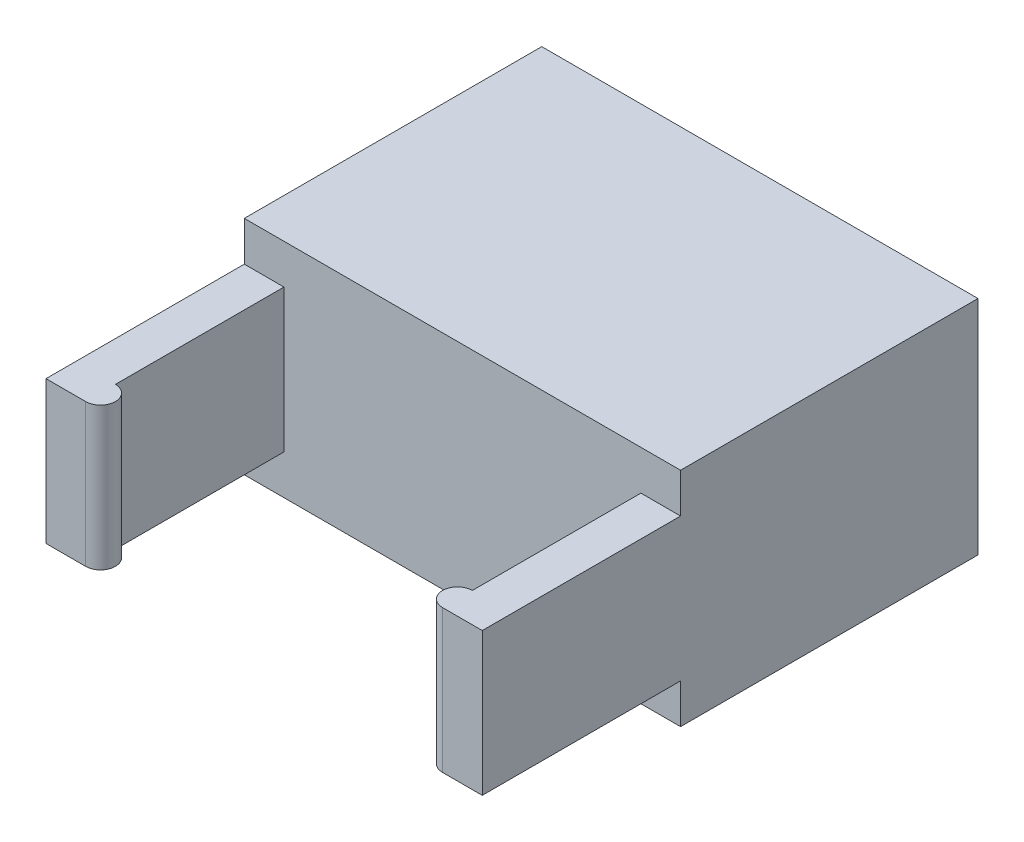
ISO-10303-21;
HEADER;
FILE_DESCRIPTION(('STEP AP214'),'2;1');
FILE_NAME('part.step','',(''),(''),'','','');
FILE_SCHEMA(('AUTOMOTIVE_DESIGN { 1 0 10303 214 1 1 1 1 }'));
ENDSEC;
DATA;
#1=APPLICATION_CONTEXT('core data for automotive mechanical design processes');
#2=APPLICATION_PROTOCOL_DEFINITION('international standard','automotive_design',2000,#1);
#3=PRODUCT_CONTEXT('',#1,'mechanical');
#4=PRODUCT('Part','Part','',(#3));
#5=PRODUCT_RELATED_PRODUCT_CATEGORY('part','',(#4));
#6=PRODUCT_DEFINITION_FORMATION('','',#4);
#7=PRODUCT_DEFINITION_CONTEXT('part definition',#1,'design');
#8=PRODUCT_DEFINITION('design','',#6,#7);
#9=PRODUCT_DEFINITION_SHAPE('','',#8);
#10=(LENGTH_UNIT() NAMED_UNIT(*) SI_UNIT(.MILLI.,.METRE.));
#11=(NAMED_UNIT(*) PLANE_ANGLE_UNIT() SI_UNIT($,.RADIAN.));
#12=(NAMED_UNIT(*) SI_UNIT($,.STERADIAN.) SOLID_ANGLE_UNIT());
#13=UNCERTAINTY_MEASURE_WITH_UNIT(LENGTH_MEASURE(1.E-05),#10,'distance_accuracy_value','');
#14=(GEOMETRIC_REPRESENTATION_CONTEXT(3) GLOBAL_UNCERTAINTY_ASSIGNED_CONTEXT((#13)) GLOBAL_UNIT_ASSIGNED_CONTEXT((#10,
#11,#12)) REPRESENTATION_CONTEXT('',''));
#15=CARTESIAN_POINT('',(0.,0.,0.));
#16=DIRECTION('',(0.,0.,1.));
#17=DIRECTION('',(1.,0.,0.));
#18=AXIS2_PLACEMENT_3D('',#15,#16,#17);
#19=CARTESIAN_POINT('',(0.,0.,15.));
#20=DIRECTION('',(0.,0.,1.));
#21=DIRECTION('',(1.,0.,0.));
#22=AXIS2_PLACEMENT_3D('',#19,#20,#21);
#23=PLANE('',#22);
#24=DIRECTION('',(1.,0.,0.));
#25=VECTOR('',#24,1.);
#26=CARTESIAN_POINT('',(0.,-3.6,15.));
#27=LINE('',#26,#25);
#28=CARTESIAN_POINT('',(-11.,-3.6,15.));
#29=VERTEX_POINT('',#28);
#30=CARTESIAN_POINT('',(-9.,-3.6,15.));
#31=VERTEX_POINT('',#30);
#32=EDGE_CURVE('E212',#29,#31,#27,.T.);
#33=ORIENTED_EDGE('',*,*,#32,.F.);
#34=DIRECTION('',(0.,1.,0.));
#35=VECTOR('',#34,1.);
#36=CARTESIAN_POINT('',(-11.,0.,15.));
#37=LINE('',#36,#35);
#38=CARTESIAN_POINT('',(-11.,-5.6,15.));
#39=VERTEX_POINT('',#38);
#40=EDGE_CURVE('E272',#39,#29,#37,.T.);
#41=ORIENTED_EDGE('',*,*,#40,.F.);
#42=DIRECTION('',(1.,0.,0.));
#43=VECTOR('',#42,1.);
#44=CARTESIAN_POINT('',(0.,-5.6,15.));
#45=LINE('',#44,#43);
#46=CARTESIAN_POINT('',(11.,-5.6,15.));
#47=VERTEX_POINT('',#46);
#48=EDGE_CURVE('E258',#39,#47,#45,.T.);
#49=ORIENTED_EDGE('',*,*,#48,.T.);
#50=DIRECTION('',(0.,1.,0.));
#51=VECTOR('',#50,1.);
#52=CARTESIAN_POINT('',(11.,0.,15.));
#53=LINE('',#52,#51);
#54=CARTESIAN_POINT('',(11.,-3.6,15.));
#55=VERTEX_POINT('',#54);
#56=EDGE_CURVE('E264',#47,#55,#53,.T.);
#57=ORIENTED_EDGE('',*,*,#56,.T.);
#58=DIRECTION('',(-1.,0.,0.));
#59=VECTOR('',#58,1.);
#60=CARTESIAN_POINT('',(0.,-3.6,15.));
#61=LINE('',#60,#59);
#62=CARTESIAN_POINT('',(9.,-3.6,15.));
#63=VERTEX_POINT('',#62);
#64=EDGE_CURVE('E70',#55,#63,#61,.T.);
#65=ORIENTED_EDGE('',*,*,#64,.T.);
#66=DIRECTION('',(0.,1.,0.));
#67=VECTOR('',#66,1.);
#68=CARTESIAN_POINT('',(9.,0.,15.));
#69=LINE('',#68,#67);
#70=CARTESIAN_POINT('',(9.,3.6,15.));
#71=VERTEX_POINT('',#70);
#72=EDGE_CURVE('E243',#63,#71,#69,.T.);
#73=ORIENTED_EDGE('',*,*,#72,.T.);
#74=DIRECTION('',(-1.,0.,0.));
#75=VECTOR('',#74,1.);
#76=CARTESIAN_POINT('',(0.,3.6,15.));
#77=LINE('',#76,#75);
#78=CARTESIAN_POINT('',(11.,3.6,15.));
#79=VERTEX_POINT('',#78);
#80=EDGE_CURVE('E240',#79,#71,#77,.T.);
#81=ORIENTED_EDGE('',*,*,#80,.F.);
#82=CARTESIAN_POINT('',(11.,5.6,15.));
#83=VERTEX_POINT('',#82);
#84=EDGE_CURVE('E262',#79,#83,#53,.T.);
#85=ORIENTED_EDGE('',*,*,#84,.T.);
#86=DIRECTION('',(1.,0.,0.));
#87=VECTOR('',#86,1.);
#88=CARTESIAN_POINT('',(0.,5.6,15.));
#89=LINE('',#88,#87);
#90=CARTESIAN_POINT('',(-11.,5.6,15.));
#91=VERTEX_POINT('',#90);
#92=EDGE_CURVE('E267',#91,#83,#89,.T.);
#93=ORIENTED_EDGE('',*,*,#92,.F.);
#94=CARTESIAN_POINT('',(-11.,3.6,15.));
#95=VERTEX_POINT('',#94);
#96=EDGE_CURVE('E271',#95,#91,#37,.T.);
#97=ORIENTED_EDGE('',*,*,#96,.F.);
#98=DIRECTION('',(1.,0.,0.));
#99=VECTOR('',#98,1.);
#100=CARTESIAN_POINT('',(0.,3.6,15.));
#101=LINE('',#100,#99);
#102=CARTESIAN_POINT('',(-9.,3.6,15.));
#103=VERTEX_POINT('',#102);
#104=EDGE_CURVE('E211',#95,#103,#101,.T.);
#105=ORIENTED_EDGE('',*,*,#104,.T.);
#106=DIRECTION('',(0.,1.,0.));
#107=VECTOR('',#106,1.);
#108=CARTESIAN_POINT('',(-9.,0.,15.));
#109=LINE('',#108,#107);
#110=EDGE_CURVE('E63',#31,#103,#109,.T.);
#111=ORIENTED_EDGE('',*,*,#110,.F.);
#112=EDGE_LOOP('',(#33,#41,#49,#57,#65,#73,#81,#85,#93,#97,#105,#111));
#113=FACE_BOUND('',#112,.T.);
#114=ADVANCED_FACE('F47',(#113),#23,.T.);
#115=CARTESIAN_POINT('',(0.,-5.6,15.));
#116=DIRECTION('',(0.,1.,0.));
#117=DIRECTION('',(0.,0.,1.));
#118=AXIS2_PLACEMENT_3D('',#115,#116,#117);
#119=PLANE('',#118);
#120=DIRECTION('',(1.,0.,0.));
#121=VECTOR('',#120,1.);
#122=CARTESIAN_POINT('',(0.,-5.6,0.));
#123=LINE('',#122,#121);
#124=CARTESIAN_POINT('',(-11.,-5.6,0.));
#125=VERTEX_POINT('',#124);
#126=CARTESIAN_POINT('',(11.,-5.6,0.));
#127=VERTEX_POINT('',#126);
#128=EDGE_CURVE('E235',#125,#127,#123,.T.);
#129=ORIENTED_EDGE('',*,*,#128,.T.);
#130=DIRECTION('',(0.,0.,-1.));
#131=VECTOR('',#130,1.);
#132=CARTESIAN_POINT('',(11.,-5.6,15.));
#133=LINE('',#132,#131);
#134=EDGE_CURVE('E11',#47,#127,#133,.T.);
#135=ORIENTED_EDGE('',*,*,#134,.F.);
#136=ORIENTED_EDGE('',*,*,#48,.F.);
#137=DIRECTION('',(0.,0.,-1.));
#138=VECTOR('',#137,1.);
#139=CARTESIAN_POINT('',(-11.,-5.6,15.));
#140=LINE('',#139,#138);
#141=EDGE_CURVE('E276',#39,#125,#140,.T.);
#142=ORIENTED_EDGE('',*,*,#141,.T.);
#143=EDGE_LOOP('',(#129,#135,#136,#142));
#144=FACE_BOUND('',#143,.T.);
#145=ADVANCED_FACE('F49',(#144),#119,.F.);
#146=CARTESIAN_POINT('',(11.,0.,15.));
#147=DIRECTION('',(-1.,0.,0.));
#148=DIRECTION('',(0.,0.,1.));
#149=AXIS2_PLACEMENT_3D('',#146,#147,#148);
#150=PLANE('',#149);
#151=DIRECTION('',(0.,1.,0.));
#152=VECTOR('',#151,1.);
#153=CARTESIAN_POINT('',(11.,0.,0.));
#154=LINE('',#153,#152);
#155=CARTESIAN_POINT('',(11.,5.6,0.));
#156=VERTEX_POINT('',#155);
#157=EDGE_CURVE('E280',#127,#156,#154,.T.);
#158=ORIENTED_EDGE('',*,*,#157,.T.);
#159=DIRECTION('',(0.,0.,-1.));
#160=VECTOR('',#159,1.);
#161=CARTESIAN_POINT('',(11.,5.6,15.));
#162=LINE('',#161,#160);
#163=EDGE_CURVE('E56',#83,#156,#162,.T.);
#164=ORIENTED_EDGE('',*,*,#163,.F.);
#165=ORIENTED_EDGE('',*,*,#84,.F.);
#166=DIRECTION('',(0.,0.,-1.));
#167=VECTOR('',#166,1.);
#168=CARTESIAN_POINT('',(11.,3.6,23.5));
#169=LINE('',#168,#167);
#170=CARTESIAN_POINT('',(11.,3.6,25.));
#171=VERTEX_POINT('',#170);
#172=EDGE_CURVE('E251',#171,#79,#169,.T.);
#173=ORIENTED_EDGE('',*,*,#172,.F.);
#174=DIRECTION('',(0.,-1.,0.));
#175=VECTOR('',#174,1.);
#176=CARTESIAN_POINT('',(11.,6.73249102153542,25.));
#177=LINE('',#176,#175);
#178=CARTESIAN_POINT('',(11.,-3.6,25.));
#179=VERTEX_POINT('',#178);
#180=EDGE_CURVE('E176',#171,#179,#177,.T.);
#181=ORIENTED_EDGE('',*,*,#180,.T.);
#182=DIRECTION('',(0.,0.,-1.));
#183=VECTOR('',#182,1.);
#184=CARTESIAN_POINT('',(11.,-3.6,23.5));
#185=LINE('',#184,#183);
#186=EDGE_CURVE('E216',#179,#55,#185,.T.);
#187=ORIENTED_EDGE('',*,*,#186,.T.);
#188=ORIENTED_EDGE('',*,*,#56,.F.);
#189=ORIENTED_EDGE('',*,*,#134,.T.);
#190=EDGE_LOOP('',(#158,#164,#165,#173,#181,#187,#188,#189));
#191=FACE_BOUND('',#190,.T.);
#192=ADVANCED_FACE('F304',(#191),#150,.F.);
#193=CARTESIAN_POINT('',(0.,5.6,15.));
#194=DIRECTION('',(0.,1.,0.));
#195=DIRECTION('',(0.,0.,1.));
#196=AXIS2_PLACEMENT_3D('',#193,#194,#195);
#197=PLANE('',#196);
#198=DIRECTION('',(1.,0.,0.));
#199=VECTOR('',#198,1.);
#200=CARTESIAN_POINT('',(0.,5.6,0.));
#201=LINE('',#200,#199);
#202=CARTESIAN_POINT('',(-11.,5.6,0.));
#203=VERTEX_POINT('',#202);
#204=EDGE_CURVE('E284',#203,#156,#201,.T.);
#205=ORIENTED_EDGE('',*,*,#204,.F.);
#206=DIRECTION('',(0.,0.,-1.));
#207=VECTOR('',#206,1.);
#208=CARTESIAN_POINT('',(-11.,5.6,15.));
#209=LINE('',#208,#207);
#210=EDGE_CURVE('E293',#91,#203,#209,.T.);
#211=ORIENTED_EDGE('',*,*,#210,.F.);
#212=ORIENTED_EDGE('',*,*,#92,.T.);
#213=ORIENTED_EDGE('',*,*,#163,.T.);
#214=EDGE_LOOP('',(#205,#211,#212,#213));
#215=FACE_BOUND('',#214,.T.);
#216=ADVANCED_FACE('F299',(#215),#197,.T.);
#217=CARTESIAN_POINT('',(-11.,0.,15.));
#218=DIRECTION('',(-1.,0.,0.));
#219=DIRECTION('',(0.,0.,1.));
#220=AXIS2_PLACEMENT_3D('',#217,#218,#219);
#221=PLANE('',#220);
#222=DIRECTION('',(0.,1.,0.));
#223=VECTOR('',#222,1.);
#224=CARTESIAN_POINT('',(-11.,0.,0.));
#225=LINE('',#224,#223);
#226=EDGE_CURVE('E263',#125,#203,#225,.T.);
#227=ORIENTED_EDGE('',*,*,#226,.F.);
#228=ORIENTED_EDGE('',*,*,#141,.F.);
#229=ORIENTED_EDGE('',*,*,#40,.T.);
#230=DIRECTION('',(0.,0.,-1.));
#231=VECTOR('',#230,1.);
#232=CARTESIAN_POINT('',(-11.,-3.6,23.5));
#233=LINE('',#232,#231);
#234=CARTESIAN_POINT('',(-11.,-3.6,25.));
#235=VERTEX_POINT('',#234);
#236=EDGE_CURVE('E210',#235,#29,#233,.T.);
#237=ORIENTED_EDGE('',*,*,#236,.F.);
#238=DIRECTION('',(0.,-1.,0.));
#239=VECTOR('',#238,1.);
#240=CARTESIAN_POINT('',(-11.,6.73249102153542,25.));
#241=LINE('',#240,#239);
#242=CARTESIAN_POINT('',(-11.,3.6,25.));
#243=VERTEX_POINT('',#242);
#244=EDGE_CURVE('E185',#243,#235,#241,.T.);
#245=ORIENTED_EDGE('',*,*,#244,.F.);
#246=DIRECTION('',(0.,0.,-1.));
#247=VECTOR('',#246,1.);
#248=CARTESIAN_POINT('',(-11.,3.6,23.5));
#249=LINE('',#248,#247);
#250=EDGE_CURVE('E224',#243,#95,#249,.T.);
#251=ORIENTED_EDGE('',*,*,#250,.T.);
#252=ORIENTED_EDGE('',*,*,#96,.T.);
#253=ORIENTED_EDGE('',*,*,#210,.T.);
#254=EDGE_LOOP('',(#227,#228,#229,#237,#245,#251,#252,#253));
#255=FACE_BOUND('',#254,.T.);
#256=ADVANCED_FACE('F311',(#255),#221,.T.);
#257=CARTESIAN_POINT('',(0.,0.,0.));
#258=DIRECTION('',(0.,0.,1.));
#259=DIRECTION('',(1.,0.,0.));
#260=AXIS2_PLACEMENT_3D('',#257,#258,#259);
#261=PLANE('',#260);
#262=ORIENTED_EDGE('',*,*,#128,.F.);
#263=ORIENTED_EDGE('',*,*,#226,.T.);
#264=ORIENTED_EDGE('',*,*,#204,.T.);
#265=ORIENTED_EDGE('',*,*,#157,.F.);
#266=EDGE_LOOP('',(#262,#263,#264,#265));
#267=FACE_BOUND('',#266,.T.);
#268=ADVANCED_FACE('F308',(#267),#261,.F.);
#269=CARTESIAN_POINT('',(0.,-3.6,23.5));
#270=DIRECTION('',(0.,-1.,0.));
#271=DIRECTION('',(1.,0.,0.));
#272=AXIS2_PLACEMENT_3D('',#269,#270,#271);
#273=PLANE('',#272);
#274=ORIENTED_EDGE('',*,*,#64,.F.);
#275=ORIENTED_EDGE('',*,*,#186,.F.);
#276=DIRECTION('',(-1.,0.,0.));
#277=VECTOR('',#276,1.);
#278=CARTESIAN_POINT('',(0.,-3.6,25.));
#279=LINE('',#278,#277);
#280=CARTESIAN_POINT('',(9.,-3.6,25.));
#281=VERTEX_POINT('',#280);
#282=EDGE_CURVE('E162',#179,#281,#279,.T.);
#283=ORIENTED_EDGE('',*,*,#282,.T.);
#284=CARTESIAN_POINT('',(9.,-3.6,24.25));
#285=DIRECTION('',(0.,1.,0.));
#286=DIRECTION('',(-1.,0.,0.));
#287=AXIS2_PLACEMENT_3D('',#284,#285,#286);
#288=CIRCLE('',#287,0.749999999999999);
#289=CARTESIAN_POINT('',(9.,-3.6,23.5));
#290=VERTEX_POINT('',#289);
#291=EDGE_CURVE('E168',#290,#281,#288,.T.);
#292=ORIENTED_EDGE('',*,*,#291,.F.);
#293=DIRECTION('',(0.,0.,-1.));
#294=VECTOR('',#293,1.);
#295=CARTESIAN_POINT('',(9.,-3.6,23.5));
#296=LINE('',#295,#294);
#297=EDGE_CURVE('E239',#290,#63,#296,.T.);
#298=ORIENTED_EDGE('',*,*,#297,.T.);
#299=EDGE_LOOP('',(#274,#275,#283,#292,#298));
#300=FACE_BOUND('',#299,.T.);
#301=ADVANCED_FACE('F317',(#300),#273,.T.);
#302=CARTESIAN_POINT('',(0.,3.6,23.5));
#303=DIRECTION('',(0.,-1.,0.));
#304=DIRECTION('',(1.,0.,0.));
#305=AXIS2_PLACEMENT_3D('',#302,#303,#304);
#306=PLANE('',#305);
#307=ORIENTED_EDGE('',*,*,#80,.T.);
#308=DIRECTION('',(0.,0.,-1.));
#309=VECTOR('',#308,1.);
#310=CARTESIAN_POINT('',(9.,3.6,23.5));
#311=LINE('',#310,#309);
#312=CARTESIAN_POINT('',(9.,3.6,23.5));
#313=VERTEX_POINT('',#312);
#314=EDGE_CURVE('E157',#313,#71,#311,.T.);
#315=ORIENTED_EDGE('',*,*,#314,.F.);
#316=CARTESIAN_POINT('',(9.,3.6,24.25));
#317=DIRECTION('',(0.,1.,0.));
#318=DIRECTION('',(0.,0.,1.));
#319=AXIS2_PLACEMENT_3D('',#316,#317,#318);
#320=CIRCLE('',#319,0.749999999999999);
#321=CARTESIAN_POINT('',(9.,3.6,25.));
#322=VERTEX_POINT('',#321);
#323=EDGE_CURVE('E148',#313,#322,#320,.T.);
#324=ORIENTED_EDGE('',*,*,#323,.T.);
#325=DIRECTION('',(-1.,0.,0.));
#326=VECTOR('',#325,1.);
#327=CARTESIAN_POINT('',(0.,3.6,25.));
#328=LINE('',#327,#326);
#329=EDGE_CURVE('E154',#171,#322,#328,.T.);
#330=ORIENTED_EDGE('',*,*,#329,.F.);
#331=ORIENTED_EDGE('',*,*,#172,.T.);
#332=EDGE_LOOP('',(#307,#315,#324,#330,#331));
#333=FACE_BOUND('',#332,.T.);
#334=ADVANCED_FACE('F151',(#333),#306,.F.);
#335=CARTESIAN_POINT('',(9.,0.,23.5));
#336=DIRECTION('',(-1.,0.,0.));
#337=DIRECTION('',(0.,-1.,0.));
#338=AXIS2_PLACEMENT_3D('',#335,#336,#337);
#339=PLANE('',#338);
#340=ORIENTED_EDGE('',*,*,#72,.F.);
#341=ORIENTED_EDGE('',*,*,#297,.F.);
#342=DIRECTION('',(0.,1.,0.));
#343=VECTOR('',#342,1.);
#344=CARTESIAN_POINT('',(9.,0.,23.5));
#345=LINE('',#344,#343);
#346=EDGE_CURVE('E236',#290,#313,#345,.T.);
#347=ORIENTED_EDGE('',*,*,#346,.T.);
#348=ORIENTED_EDGE('',*,*,#314,.T.);
#349=EDGE_LOOP('',(#340,#341,#347,#348));
#350=FACE_BOUND('',#349,.T.);
#351=ADVANCED_FACE('F320',(#350),#339,.T.);
#352=CARTESIAN_POINT('',(0.,-3.6,23.5));
#353=DIRECTION('',(0.,1.,0.));
#354=DIRECTION('',(-1.,0.,0.));
#355=AXIS2_PLACEMENT_3D('',#352,#353,#354);
#356=PLANE('',#355);
#357=ORIENTED_EDGE('',*,*,#32,.T.);
#358=DIRECTION('',(0.,0.,-1.));
#359=VECTOR('',#358,1.);
#360=CARTESIAN_POINT('',(-9.,-3.6,23.5));
#361=LINE('',#360,#359);
#362=CARTESIAN_POINT('',(-9.,-3.6,23.5));
#363=VERTEX_POINT('',#362);
#364=EDGE_CURVE('E232',#363,#31,#361,.T.);
#365=ORIENTED_EDGE('',*,*,#364,.F.);
#366=CARTESIAN_POINT('',(-9.,-3.6,24.25));
#367=DIRECTION('',(0.,1.,0.));
#368=DIRECTION('',(-1.,0.,0.));
#369=AXIS2_PLACEMENT_3D('',#366,#367,#368);
#370=CIRCLE('',#369,0.749999999999999);
#371=CARTESIAN_POINT('',(-9.,-3.6,25.));
#372=VERTEX_POINT('',#371);
#373=EDGE_CURVE('E191',#372,#363,#370,.T.);
#374=ORIENTED_EDGE('',*,*,#373,.F.);
#375=DIRECTION('',(1.,0.,0.));
#376=VECTOR('',#375,1.);
#377=CARTESIAN_POINT('',(0.,-3.6,25.));
#378=LINE('',#377,#376);
#379=EDGE_CURVE('E186',#235,#372,#378,.T.);
#380=ORIENTED_EDGE('',*,*,#379,.F.);
#381=ORIENTED_EDGE('',*,*,#236,.T.);
#382=EDGE_LOOP('',(#357,#365,#374,#380,#381));
#383=FACE_BOUND('',#382,.T.);
#384=ADVANCED_FACE('F322',(#383),#356,.F.);
#385=CARTESIAN_POINT('',(-9.,0.,23.5));
#386=DIRECTION('',(-1.,0.,0.));
#387=DIRECTION('',(0.,0.,1.));
#388=AXIS2_PLACEMENT_3D('',#385,#386,#387);
#389=PLANE('',#388);
#390=ORIENTED_EDGE('',*,*,#110,.T.);
#391=DIRECTION('',(0.,0.,-1.));
#392=VECTOR('',#391,1.);
#393=CARTESIAN_POINT('',(-9.,3.6,23.5));
#394=LINE('',#393,#392);
#395=CARTESIAN_POINT('',(-9.,3.6,23.5));
#396=VERTEX_POINT('',#395);
#397=EDGE_CURVE('E228',#396,#103,#394,.T.);
#398=ORIENTED_EDGE('',*,*,#397,.F.);
#399=DIRECTION('',(0.,1.,0.));
#400=VECTOR('',#399,1.);
#401=CARTESIAN_POINT('',(-9.,0.,23.5));
#402=LINE('',#401,#400);
#403=EDGE_CURVE('E206',#363,#396,#402,.T.);
#404=ORIENTED_EDGE('',*,*,#403,.F.);
#405=ORIENTED_EDGE('',*,*,#364,.T.);
#406=EDGE_LOOP('',(#390,#398,#404,#405));
#407=FACE_BOUND('',#406,.T.);
#408=ADVANCED_FACE('F329',(#407),#389,.F.);
#409=CARTESIAN_POINT('',(0.,3.6,23.5));
#410=DIRECTION('',(0.,1.,0.));
#411=DIRECTION('',(0.,0.,1.));
#412=AXIS2_PLACEMENT_3D('',#409,#410,#411);
#413=PLANE('',#412);
#414=ORIENTED_EDGE('',*,*,#104,.F.);
#415=ORIENTED_EDGE('',*,*,#250,.F.);
#416=DIRECTION('',(1.,0.,0.));
#417=VECTOR('',#416,1.);
#418=CARTESIAN_POINT('',(0.,3.6,25.));
#419=LINE('',#418,#417);
#420=CARTESIAN_POINT('',(-9.,3.6,25.));
#421=VERTEX_POINT('',#420);
#422=EDGE_CURVE('E194',#243,#421,#419,.T.);
#423=ORIENTED_EDGE('',*,*,#422,.T.);
#424=CARTESIAN_POINT('',(-9.,3.6,24.25));
#425=DIRECTION('',(0.,1.,0.));
#426=DIRECTION('',(0.,0.,1.));
#427=AXIS2_PLACEMENT_3D('',#424,#425,#426);
#428=CIRCLE('',#427,0.749999999999999);
#429=EDGE_CURVE('E198',#421,#396,#428,.T.);
#430=ORIENTED_EDGE('',*,*,#429,.T.);
#431=ORIENTED_EDGE('',*,*,#397,.T.);
#432=EDGE_LOOP('',(#414,#415,#423,#430,#431));
#433=FACE_BOUND('',#432,.T.);
#434=ADVANCED_FACE('F393',(#433),#413,.T.);
#435=CARTESIAN_POINT('',(0.,6.73249102153542,25.));
#436=DIRECTION('',(0.,0.,-1.));
#437=DIRECTION('',(-1.,0.,0.));
#438=AXIS2_PLACEMENT_3D('',#435,#436,#437);
#439=PLANE('',#438);
#440=ORIENTED_EDGE('',*,*,#422,.F.);
#441=ORIENTED_EDGE('',*,*,#244,.T.);
#442=ORIENTED_EDGE('',*,*,#379,.T.);
#443=DIRECTION('',(0.,-1.,0.));
#444=VECTOR('',#443,1.);
#445=CARTESIAN_POINT('',(-9.,6.73249102153542,25.));
#446=LINE('',#445,#444);
#447=EDGE_CURVE('E190',#421,#372,#446,.T.);
#448=ORIENTED_EDGE('',*,*,#447,.F.);
#449=EDGE_LOOP('',(#440,#441,#442,#448));
#450=FACE_BOUND('',#449,.T.);
#451=ADVANCED_FACE('F390',(#450),#439,.F.);
#452=CARTESIAN_POINT('',(-9.,6.73249102153542,24.25));
#453=DIRECTION('',(0.,-1.,0.));
#454=DIRECTION('',(0.,0.,-1.));
#455=AXIS2_PLACEMENT_3D('',#452,#453,#454);
#456=CYLINDRICAL_SURFACE('',#455,0.749999999999999);
#457=ORIENTED_EDGE('',*,*,#429,.F.);
#458=ORIENTED_EDGE('',*,*,#447,.T.);
#459=ORIENTED_EDGE('',*,*,#373,.T.);
#460=ORIENTED_EDGE('',*,*,#403,.T.);
#461=EDGE_LOOP('',(#457,#458,#459,#460));
#462=FACE_BOUND('',#461,.T.);
#463=ADVANCED_FACE('F356',(#462),#456,.T.);
#464=CARTESIAN_POINT('',(0.,6.73249102153542,25.));
#465=DIRECTION('',(0.,0.,1.));
#466=DIRECTION('',(1.,0.,0.));
#467=AXIS2_PLACEMENT_3D('',#464,#465,#466);
#468=PLANE('',#467);
#469=ORIENTED_EDGE('',*,*,#180,.F.);
#470=ORIENTED_EDGE('',*,*,#329,.T.);
#471=DIRECTION('',(0.,-1.,0.));
#472=VECTOR('',#471,1.);
#473=CARTESIAN_POINT('',(9.,6.73249102153542,25.));
#474=LINE('',#473,#472);
#475=EDGE_CURVE('E165',#322,#281,#474,.T.);
#476=ORIENTED_EDGE('',*,*,#475,.T.);
#477=ORIENTED_EDGE('',*,*,#282,.F.);
#478=EDGE_LOOP('',(#469,#470,#476,#477));
#479=FACE_BOUND('',#478,.T.);
#480=ADVANCED_FACE('F174',(#479),#468,.T.);
#481=CARTESIAN_POINT('',(9.,6.73249102153542,24.25));
#482=DIRECTION('',(0.,-1.,0.));
#483=DIRECTION('',(0.,0.,-1.));
#484=AXIS2_PLACEMENT_3D('',#481,#482,#483);
#485=CYLINDRICAL_SURFACE('',#484,0.749999999999999);
#486=ORIENTED_EDGE('',*,*,#323,.F.);
#487=ORIENTED_EDGE('',*,*,#346,.F.);
#488=ORIENTED_EDGE('',*,*,#291,.T.);
#489=ORIENTED_EDGE('',*,*,#475,.F.);
#490=EDGE_LOOP('',(#486,#487,#488,#489));
#491=FACE_BOUND('',#490,.T.);
#492=ADVANCED_FACE('F166',(#491),#485,.T.);
#493=CLOSED_SHELL('',(#114,#145,#192,#216,#256,#268,#301,#334,#351,#384,#408,#434,#451,#463,
#480,#492));
#494=MANIFOLD_SOLID_BREP('B2',#493);
#495=ADVANCED_BREP_SHAPE_REPRESENTATION('',(#18,#494),#14);
#496=SHAPE_DEFINITION_REPRESENTATION(#9,#495);
ENDSEC;
END-ISO-10303-21;
